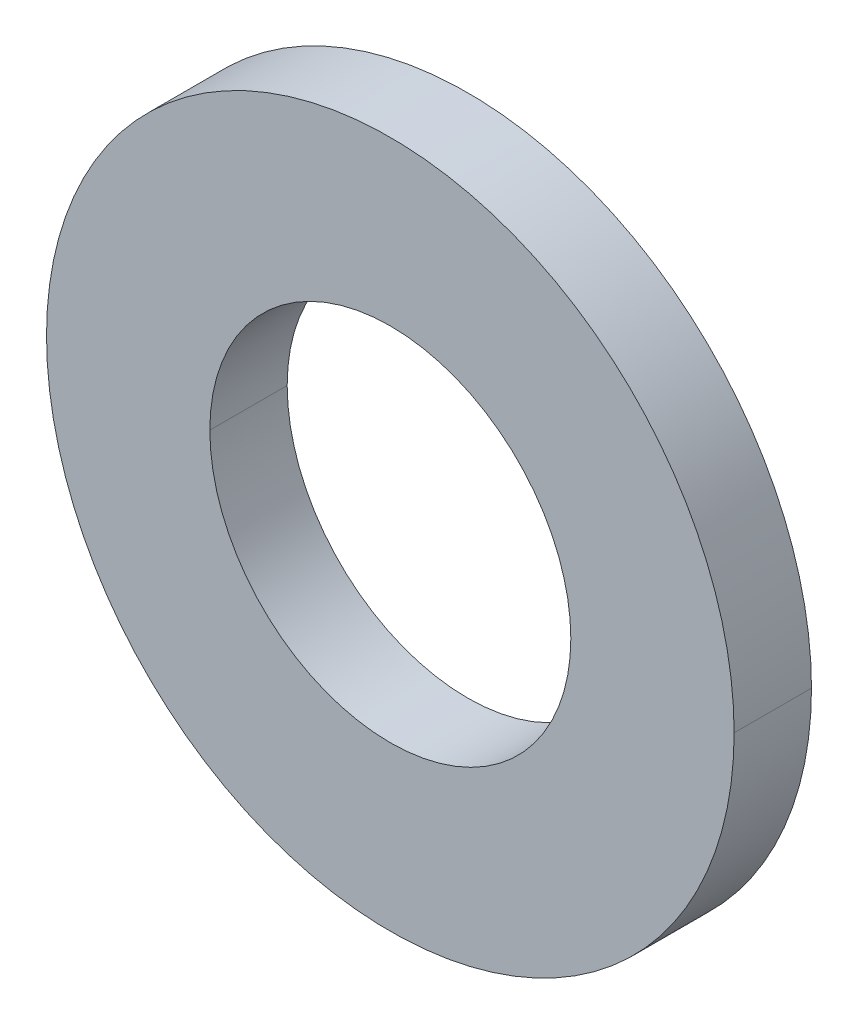
ISO-10303-21;
HEADER;
FILE_DESCRIPTION(('STEP AP214'),'2;1');
FILE_NAME('part.step','',(''),(''),'','','');
FILE_SCHEMA(('AUTOMOTIVE_DESIGN { 1 0 10303 214 1 1 1 1 }'));
ENDSEC;
DATA;
#1=APPLICATION_CONTEXT('core data for automotive mechanical design processes');
#2=APPLICATION_PROTOCOL_DEFINITION('international standard','automotive_design',2000,#1);
#3=PRODUCT_CONTEXT('',#1,'mechanical');
#4=PRODUCT('Part','Part','',(#3));
#5=PRODUCT_RELATED_PRODUCT_CATEGORY('part','',(#4));
#6=PRODUCT_DEFINITION_FORMATION('','',#4);
#7=PRODUCT_DEFINITION_CONTEXT('part definition',#1,'design');
#8=PRODUCT_DEFINITION('design','',#6,#7);
#9=PRODUCT_DEFINITION_SHAPE('','',#8);
#10=(LENGTH_UNIT() NAMED_UNIT(*) SI_UNIT(.MILLI.,.METRE.));
#11=(NAMED_UNIT(*) PLANE_ANGLE_UNIT() SI_UNIT($,.RADIAN.));
#12=(NAMED_UNIT(*) SI_UNIT($,.STERADIAN.) SOLID_ANGLE_UNIT());
#13=UNCERTAINTY_MEASURE_WITH_UNIT(LENGTH_MEASURE(1.E-05),#10,'distance_accuracy_value','');
#14=(GEOMETRIC_REPRESENTATION_CONTEXT(3) GLOBAL_UNCERTAINTY_ASSIGNED_CONTEXT((#13)) GLOBAL_UNIT_ASSIGNED_CONTEXT((#10,
#11,#12)) REPRESENTATION_CONTEXT('',''));
#15=CARTESIAN_POINT('',(0.,0.,0.));
#16=DIRECTION('',(0.,0.,1.));
#17=DIRECTION('',(1.,0.,0.));
#18=AXIS2_PLACEMENT_3D('',#15,#16,#17);
#19=CARTESIAN_POINT('',(0.,0.,1.8));
#20=DIRECTION('',(0.,0.,-1.));
#21=DIRECTION('',(-1.,0.,0.));
#22=AXIS2_PLACEMENT_3D('',#19,#20,#21);
#23=CYLINDRICAL_SURFACE('',#22,4.2);
#24=CARTESIAN_POINT('',(0.,0.,1.8));
#25=DIRECTION('',(0.,0.,1.));
#26=DIRECTION('',(1.,0.,0.));
#27=AXIS2_PLACEMENT_3D('',#24,#25,#26);
#28=CIRCLE('',#27,4.2);
#29=CARTESIAN_POINT('',(-4.2,0.,1.8));
#30=VERTEX_POINT('',#29);
#31=CARTESIAN_POINT('',(4.2,0.,1.8));
#32=VERTEX_POINT('',#31);
#33=EDGE_CURVE('E11',#30,#32,#28,.T.);
#34=ORIENTED_EDGE('',*,*,#33,.T.);
#35=DIRECTION('',(0.,0.,-1.));
#36=VECTOR('',#35,1.);
#37=CARTESIAN_POINT('',(4.2,0.,1.8));
#38=LINE('',#37,#36);
#39=CARTESIAN_POINT('',(4.2,0.,0.));
#40=VERTEX_POINT('',#39);
#41=EDGE_CURVE('E27',#32,#40,#38,.T.);
#42=ORIENTED_EDGE('',*,*,#41,.T.);
#43=CARTESIAN_POINT('',(0.,0.,0.));
#44=DIRECTION('',(0.,0.,1.));
#45=DIRECTION('',(1.,0.,0.));
#46=AXIS2_PLACEMENT_3D('',#43,#44,#45);
#47=CIRCLE('',#46,4.2);
#48=CARTESIAN_POINT('',(-4.2,0.,0.));
#49=VERTEX_POINT('',#48);
#50=EDGE_CURVE('E88',#49,#40,#47,.T.);
#51=ORIENTED_EDGE('',*,*,#50,.F.);
#52=DIRECTION('',(0.,0.,-1.));
#53=VECTOR('',#52,1.);
#54=CARTESIAN_POINT('',(-4.2,0.,1.8));
#55=LINE('',#54,#53);
#56=EDGE_CURVE('E66',#30,#49,#55,.T.);
#57=ORIENTED_EDGE('',*,*,#56,.F.);
#58=EDGE_LOOP('',(#34,#42,#51,#57));
#59=FACE_BOUND('',#58,.T.);
#60=ADVANCED_FACE('F16',(#59),#23,.F.);
#61=CARTESIAN_POINT('',(0.,0.,1.8));
#62=DIRECTION('',(0.,0.,-1.));
#63=DIRECTION('',(-1.,0.,0.));
#64=AXIS2_PLACEMENT_3D('',#61,#62,#63);
#65=CYLINDRICAL_SURFACE('',#64,8.);
#66=CARTESIAN_POINT('',(0.,0.,1.8));
#67=DIRECTION('',(0.,0.,1.));
#68=DIRECTION('',(1.,0.,0.));
#69=AXIS2_PLACEMENT_3D('',#66,#67,#68);
#70=CIRCLE('',#69,8.);
#71=CARTESIAN_POINT('',(8.,0.,1.8));
#72=VERTEX_POINT('',#71);
#73=CARTESIAN_POINT('',(-8.,0.,1.8));
#74=VERTEX_POINT('',#73);
#75=EDGE_CURVE('E76',#72,#74,#70,.T.);
#76=ORIENTED_EDGE('',*,*,#75,.F.);
#77=DIRECTION('',(0.,0.,-1.));
#78=VECTOR('',#77,1.);
#79=CARTESIAN_POINT('',(8.,0.,1.8));
#80=LINE('',#79,#78);
#81=CARTESIAN_POINT('',(8.,0.,0.));
#82=VERTEX_POINT('',#81);
#83=EDGE_CURVE('E80',#72,#82,#80,.T.);
#84=ORIENTED_EDGE('',*,*,#83,.T.);
#85=CARTESIAN_POINT('',(0.,0.,0.));
#86=DIRECTION('',(0.,0.,1.));
#87=DIRECTION('',(1.,0.,0.));
#88=AXIS2_PLACEMENT_3D('',#85,#86,#87);
#89=CIRCLE('',#88,8.);
#90=CARTESIAN_POINT('',(-8.,0.,0.));
#91=VERTEX_POINT('',#90);
#92=EDGE_CURVE('E93',#82,#91,#89,.T.);
#93=ORIENTED_EDGE('',*,*,#92,.T.);
#94=DIRECTION('',(0.,0.,-1.));
#95=VECTOR('',#94,1.);
#96=CARTESIAN_POINT('',(-8.,0.,1.8));
#97=LINE('',#96,#95);
#98=EDGE_CURVE('E82',#74,#91,#97,.T.);
#99=ORIENTED_EDGE('',*,*,#98,.F.);
#100=EDGE_LOOP('',(#76,#84,#93,#99));
#101=FACE_BOUND('',#100,.T.);
#102=ADVANCED_FACE('F78',(#101),#65,.T.);
#103=CARTESIAN_POINT('',(0.,0.,1.8));
#104=DIRECTION('',(0.,0.,1.));
#105=DIRECTION('',(1.,0.,0.));
#106=AXIS2_PLACEMENT_3D('',#103,#104,#105);
#107=PLANE('',#106);
#108=CARTESIAN_POINT('',(0.,0.,1.8));
#109=DIRECTION('',(0.,0.,1.));
#110=DIRECTION('',(1.,0.,0.));
#111=AXIS2_PLACEMENT_3D('',#108,#109,#110);
#112=CIRCLE('',#111,8.);
#113=EDGE_CURVE('E87',#74,#72,#112,.T.);
#114=ORIENTED_EDGE('',*,*,#113,.T.);
#115=ORIENTED_EDGE('',*,*,#75,.T.);
#116=EDGE_LOOP('',(#114,#115));
#117=FACE_BOUND('',#116,.T.);
#118=ORIENTED_EDGE('',*,*,#33,.F.);
#119=CARTESIAN_POINT('',(0.,0.,1.8));
#120=DIRECTION('',(0.,0.,1.));
#121=DIRECTION('',(1.,0.,0.));
#122=AXIS2_PLACEMENT_3D('',#119,#120,#121);
#123=CIRCLE('',#122,4.2);
#124=EDGE_CURVE('E108',#32,#30,#123,.T.);
#125=ORIENTED_EDGE('',*,*,#124,.F.);
#126=EDGE_LOOP('',(#118,#125));
#127=FACE_BOUND('',#126,.T.);
#128=ADVANCED_FACE('F94',(#117,#127),#107,.T.);
#129=CARTESIAN_POINT('',(0.,0.,0.));
#130=DIRECTION('',(0.,0.,1.));
#131=DIRECTION('',(1.,0.,0.));
#132=AXIS2_PLACEMENT_3D('',#129,#130,#131);
#133=PLANE('',#132);
#134=CARTESIAN_POINT('',(0.,0.,0.));
#135=DIRECTION('',(0.,0.,1.));
#136=DIRECTION('',(1.,0.,0.));
#137=AXIS2_PLACEMENT_3D('',#134,#135,#136);
#138=CIRCLE('',#137,8.);
#139=EDGE_CURVE('E20',#91,#82,#138,.T.);
#140=ORIENTED_EDGE('',*,*,#139,.F.);
#141=ORIENTED_EDGE('',*,*,#92,.F.);
#142=EDGE_LOOP('',(#140,#141));
#143=FACE_BOUND('',#142,.T.);
#144=ORIENTED_EDGE('',*,*,#50,.T.);
#145=CARTESIAN_POINT('',(0.,0.,0.));
#146=DIRECTION('',(0.,0.,1.));
#147=DIRECTION('',(1.,0.,0.));
#148=AXIS2_PLACEMENT_3D('',#145,#146,#147);
#149=CIRCLE('',#148,4.2);
#150=EDGE_CURVE('E104',#40,#49,#149,.T.);
#151=ORIENTED_EDGE('',*,*,#150,.T.);
#152=EDGE_LOOP('',(#144,#151));
#153=FACE_BOUND('',#152,.T.);
#154=ADVANCED_FACE('F127',(#143,#153),#133,.F.);
#155=CARTESIAN_POINT('',(0.,0.,1.8));
#156=DIRECTION('',(0.,0.,-1.));
#157=DIRECTION('',(-1.,0.,0.));
#158=AXIS2_PLACEMENT_3D('',#155,#156,#157);
#159=CYLINDRICAL_SURFACE('',#158,8.);
#160=ORIENTED_EDGE('',*,*,#83,.F.);
#161=ORIENTED_EDGE('',*,*,#113,.F.);
#162=ORIENTED_EDGE('',*,*,#98,.T.);
#163=ORIENTED_EDGE('',*,*,#139,.T.);
#164=EDGE_LOOP('',(#160,#161,#162,#163));
#165=FACE_BOUND('',#164,.T.);
#166=ADVANCED_FACE('F18',(#165),#159,.T.);
#167=CARTESIAN_POINT('',(0.,0.,1.8));
#168=DIRECTION('',(0.,0.,-1.));
#169=DIRECTION('',(-1.,0.,0.));
#170=AXIS2_PLACEMENT_3D('',#167,#168,#169);
#171=CYLINDRICAL_SURFACE('',#170,4.2);
#172=ORIENTED_EDGE('',*,*,#41,.F.);
#173=ORIENTED_EDGE('',*,*,#124,.T.);
#174=ORIENTED_EDGE('',*,*,#56,.T.);
#175=ORIENTED_EDGE('',*,*,#150,.F.);
#176=EDGE_LOOP('',(#172,#173,#174,#175));
#177=FACE_BOUND('',#176,.T.);
#178=ADVANCED_FACE('F158',(#177),#171,.F.);
#179=CLOSED_SHELL('',(#60,#102,#128,#154,#166,#178));
#180=MANIFOLD_SOLID_BREP('B1',#179);
#181=ADVANCED_BREP_SHAPE_REPRESENTATION('',(#18,#180),#14);
#182=SHAPE_DEFINITION_REPRESENTATION(#9,#181);
ENDSEC;
END-ISO-10303-21;
